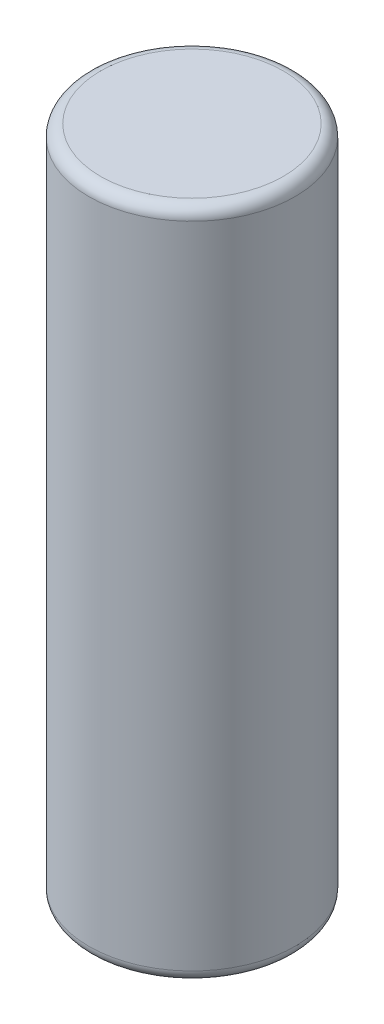
ISO-10303-21;
HEADER;
FILE_DESCRIPTION(('STEP AP214'),'2;1');
FILE_NAME('part.step','',(''),(''),'','','');
FILE_SCHEMA(('AUTOMOTIVE_DESIGN { 1 0 10303 214 1 1 1 1 }'));
ENDSEC;
DATA;
#1=APPLICATION_CONTEXT('core data for automotive mechanical design processes');
#2=APPLICATION_PROTOCOL_DEFINITION('international standard','automotive_design',2000,#1);
#3=PRODUCT_CONTEXT('',#1,'mechanical');
#4=PRODUCT('Part','Part','',(#3));
#5=PRODUCT_RELATED_PRODUCT_CATEGORY('part','',(#4));
#6=PRODUCT_DEFINITION_FORMATION('','',#4);
#7=PRODUCT_DEFINITION_CONTEXT('part definition',#1,'design');
#8=PRODUCT_DEFINITION('design','',#6,#7);
#9=PRODUCT_DEFINITION_SHAPE('','',#8);
#10=(LENGTH_UNIT() NAMED_UNIT(*) SI_UNIT(.MILLI.,.METRE.));
#11=(NAMED_UNIT(*) PLANE_ANGLE_UNIT() SI_UNIT($,.RADIAN.));
#12=(NAMED_UNIT(*) SI_UNIT($,.STERADIAN.) SOLID_ANGLE_UNIT());
#13=UNCERTAINTY_MEASURE_WITH_UNIT(LENGTH_MEASURE(1.E-05),#10,'distance_accuracy_value','');
#14=(GEOMETRIC_REPRESENTATION_CONTEXT(3) GLOBAL_UNCERTAINTY_ASSIGNED_CONTEXT((#13)) GLOBAL_UNIT_ASSIGNED_CONTEXT((#10,
#11,#12)) REPRESENTATION_CONTEXT('',''));
#15=CARTESIAN_POINT('',(0.,0.,0.));
#16=DIRECTION('',(0.,0.,1.));
#17=DIRECTION('',(1.,0.,0.));
#18=AXIS2_PLACEMENT_3D('',#15,#16,#17);
#19=CARTESIAN_POINT('',(0.,92.,0.));
#20=DIRECTION('',(0.,-1.,0.));
#21=DIRECTION('',(0.,0.,-1.));
#22=AXIS2_PLACEMENT_3D('',#19,#20,#21);
#23=CYLINDRICAL_SURFACE('',#22,14.1);
#24=CARTESIAN_POINT('',(0.,1.6,0.));
#25=DIRECTION('',(0.,1.,0.));
#26=DIRECTION('',(0.,0.,1.));
#27=AXIS2_PLACEMENT_3D('',#24,#25,#26);
#28=CIRCLE('',#27,14.1);
#29=CARTESIAN_POINT('',(0.,1.6,14.1));
#30=VERTEX_POINT('',#29);
#31=EDGE_CURVE('E48',#30,#30,#28,.T.);
#32=ORIENTED_EDGE('',*,*,#31,.T.);
#33=EDGE_LOOP('',(#32));
#34=FACE_BOUND('',#33,.T.);
#35=CARTESIAN_POINT('',(0.,90.4,0.));
#36=DIRECTION('',(0.,1.,0.));
#37=DIRECTION('',(0.,0.,1.));
#38=AXIS2_PLACEMENT_3D('',#35,#36,#37);
#39=CIRCLE('',#38,14.1);
#40=CARTESIAN_POINT('',(0.,90.4,14.1));
#41=VERTEX_POINT('',#40);
#42=EDGE_CURVE('E52',#41,#41,#39,.F.);
#43=ORIENTED_EDGE('',*,*,#42,.T.);
#44=EDGE_LOOP('',(#43));
#45=FACE_BOUND('',#44,.T.);
#46=ADVANCED_FACE('F37',(#34,#45),#23,.T.);
#47=CARTESIAN_POINT('',(0.,92.,0.));
#48=DIRECTION('',(0.,1.,0.));
#49=DIRECTION('',(0.,0.,1.));
#50=AXIS2_PLACEMENT_3D('',#47,#48,#49);
#51=PLANE('',#50);
#52=CARTESIAN_POINT('',(0.,92.,0.));
#53=DIRECTION('',(0.,1.,0.));
#54=DIRECTION('',(0.,0.,1.));
#55=AXIS2_PLACEMENT_3D('',#52,#53,#54);
#56=CIRCLE('',#55,12.5);
#57=CARTESIAN_POINT('',(0.,92.,12.5));
#58=VERTEX_POINT('',#57);
#59=EDGE_CURVE('E10',#58,#58,#56,.T.);
#60=ORIENTED_EDGE('',*,*,#59,.T.);
#61=EDGE_LOOP('',(#60));
#62=FACE_BOUND('',#61,.T.);
#63=ADVANCED_FACE('F68',(#62),#51,.T.);
#64=CARTESIAN_POINT('',(0.,0.,0.));
#65=DIRECTION('',(0.,1.,0.));
#66=DIRECTION('',(0.,0.,1.));
#67=AXIS2_PLACEMENT_3D('',#64,#65,#66);
#68=PLANE('',#67);
#69=CARTESIAN_POINT('',(0.,0.,0.));
#70=DIRECTION('',(0.,1.,0.));
#71=DIRECTION('',(0.,0.,1.));
#72=AXIS2_PLACEMENT_3D('',#69,#70,#71);
#73=CIRCLE('',#72,12.5);
#74=CARTESIAN_POINT('',(0.,0.,12.5));
#75=VERTEX_POINT('',#74);
#76=EDGE_CURVE('E44',#75,#75,#73,.F.);
#77=ORIENTED_EDGE('',*,*,#76,.T.);
#78=EDGE_LOOP('',(#77));
#79=FACE_BOUND('',#78,.T.);
#80=ADVANCED_FACE('F65',(#79),#68,.F.);
#81=CARTESIAN_POINT('',(0.,1.6,0.));
#82=DIRECTION('',(0.,1.,0.));
#83=DIRECTION('',(0.,0.,1.));
#84=AXIS2_PLACEMENT_3D('',#81,#82,#83);
#85=TOROIDAL_SURFACE('',#84,12.5,1.6);
#86=ORIENTED_EDGE('',*,*,#76,.F.);
#87=EDGE_LOOP('',(#86));
#88=FACE_BOUND('',#87,.T.);
#89=ORIENTED_EDGE('',*,*,#31,.F.);
#90=EDGE_LOOP('',(#89));
#91=FACE_BOUND('',#90,.T.);
#92=ADVANCED_FACE('F61',(#88,#91),#85,.T.);
#93=CARTESIAN_POINT('',(0.,90.4,0.));
#94=DIRECTION('',(0.,1.,0.));
#95=DIRECTION('',(0.,0.,1.));
#96=AXIS2_PLACEMENT_3D('',#93,#94,#95);
#97=TOROIDAL_SURFACE('',#96,12.5,1.6);
#98=ORIENTED_EDGE('',*,*,#42,.F.);
#99=EDGE_LOOP('',(#98));
#100=FACE_BOUND('',#99,.T.);
#101=ORIENTED_EDGE('',*,*,#59,.F.);
#102=EDGE_LOOP('',(#101));
#103=FACE_BOUND('',#102,.T.);
#104=ADVANCED_FACE('F39',(#100,#103),#97,.T.);
#105=CLOSED_SHELL('',(#46,#63,#80,#92,#104));
#106=MANIFOLD_SOLID_BREP('B2',#105);
#107=ADVANCED_BREP_SHAPE_REPRESENTATION('',(#18,#106),#14);
#108=SHAPE_DEFINITION_REPRESENTATION(#9,#107);
ENDSEC;
END-ISO-10303-21;
